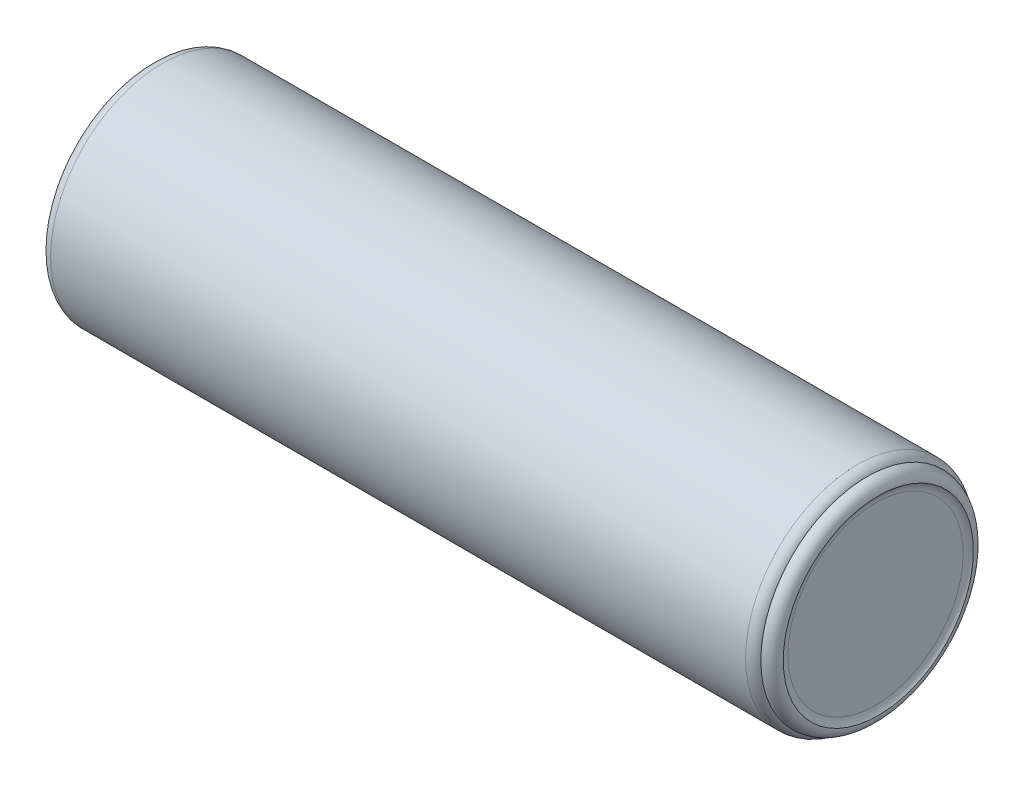
ISO-10303-21;
HEADER;
FILE_DESCRIPTION(('STEP AP214'),'2;1');
FILE_NAME('part.step','',(''),(''),'','','');
FILE_SCHEMA(('AUTOMOTIVE_DESIGN { 1 0 10303 214 1 1 1 1 }'));
ENDSEC;
DATA;
#1=APPLICATION_CONTEXT('core data for automotive mechanical design processes');
#2=APPLICATION_PROTOCOL_DEFINITION('international standard','automotive_design',2000,#1);
#3=PRODUCT_CONTEXT('',#1,'mechanical');
#4=PRODUCT('Part','Part','',(#3));
#5=PRODUCT_RELATED_PRODUCT_CATEGORY('part','',(#4));
#6=PRODUCT_DEFINITION_FORMATION('','',#4);
#7=PRODUCT_DEFINITION_CONTEXT('part definition',#1,'design');
#8=PRODUCT_DEFINITION('design','',#6,#7);
#9=PRODUCT_DEFINITION_SHAPE('','',#8);
#10=(LENGTH_UNIT() NAMED_UNIT(*) SI_UNIT(.MILLI.,.METRE.));
#11=(NAMED_UNIT(*) PLANE_ANGLE_UNIT() SI_UNIT($,.RADIAN.));
#12=(NAMED_UNIT(*) SI_UNIT($,.STERADIAN.) SOLID_ANGLE_UNIT());
#13=UNCERTAINTY_MEASURE_WITH_UNIT(LENGTH_MEASURE(1.E-05),#10,'distance_accuracy_value','');
#14=(GEOMETRIC_REPRESENTATION_CONTEXT(3) GLOBAL_UNCERTAINTY_ASSIGNED_CONTEXT((#13)) GLOBAL_UNIT_ASSIGNED_CONTEXT((#10,
#11,#12)) REPRESENTATION_CONTEXT('',''));
#15=CARTESIAN_POINT('',(0.,0.,0.));
#16=DIRECTION('',(0.,0.,1.));
#17=DIRECTION('',(1.,0.,0.));
#18=AXIS2_PLACEMENT_3D('',#15,#16,#17);
#19=CARTESIAN_POINT('',(3.275,0.85,0.));
#20=DIRECTION('',(-1.,0.,0.));
#21=DIRECTION('',(0.,0.,1.));
#22=AXIS2_PLACEMENT_3D('',#19,#20,#21);
#23=PLANE('',#22);
#24=CARTESIAN_POINT('',(3.275,0.,0.));
#25=DIRECTION('',(-1.,0.,0.));
#26=DIRECTION('',(0.,0.,-1.));
#27=AXIS2_PLACEMENT_3D('',#24,#25,#26);
#28=CIRCLE('',#27,0.783856217223);
#29=CARTESIAN_POINT('',(3.275,0.,0.783856217223));
#30=VERTEX_POINT('',#29);
#31=CARTESIAN_POINT('',(3.275,0.,-0.783856217223));
#32=VERTEX_POINT('',#31);
#33=EDGE_CURVE('E45',#30,#32,#28,.F.);
#34=ORIENTED_EDGE('',*,*,#33,.T.);
#35=CARTESIAN_POINT('',(3.275,0.,0.));
#36=DIRECTION('',(-1.,0.,0.));
#37=DIRECTION('',(0.,0.,1.));
#38=AXIS2_PLACEMENT_3D('',#35,#36,#37);
#39=CIRCLE('',#38,0.783856217223);
#40=EDGE_CURVE('E48',#32,#30,#39,.F.);
#41=ORIENTED_EDGE('',*,*,#40,.T.);
#42=EDGE_LOOP('',(#34,#41));
#43=FACE_BOUND('',#42,.T.);
#44=ADVANCED_FACE('F17',(#43),#23,.F.);
#45=CARTESIAN_POINT('',(3.375,0.,0.));
#46=DIRECTION('',(1.,0.,0.));
#47=DIRECTION('',(0.,0.,-1.));
#48=AXIS2_PLACEMENT_3D('',#45,#46,#47);
#49=TOROIDAL_SURFACE('',#48,0.783856217223,0.1);
#50=ORIENTED_EDGE('',*,*,#40,.F.);
#51=ORIENTED_EDGE('',*,*,#33,.F.);
#52=EDGE_LOOP('',(#50,#51));
#53=FACE_BOUND('',#52,.T.);
#54=CARTESIAN_POINT('',(3.3,0.,0.));
#55=DIRECTION('',(-1.,0.,0.));
#56=DIRECTION('',(0.,0.,1.));
#57=AXIS2_PLACEMENT_3D('',#54,#55,#56);
#58=CIRCLE('',#57,0.85);
#59=CARTESIAN_POINT('',(3.3,0.,0.85));
#60=VERTEX_POINT('',#59);
#61=EDGE_CURVE('E52',#60,#60,#58,.T.);
#62=ORIENTED_EDGE('',*,*,#61,.F.);
#63=EDGE_LOOP('',(#62));
#64=FACE_BOUND('',#63,.T.);
#65=ADVANCED_FACE('F55',(#53,#64),#49,.F.);
#66=CARTESIAN_POINT('',(3.2,0.,0.));
#67=DIRECTION('',(-1.,0.,0.));
#68=DIRECTION('',(0.,0.,1.));
#69=AXIS2_PLACEMENT_3D('',#66,#67,#68);
#70=TOROIDAL_SURFACE('',#69,0.85,0.1);
#71=CARTESIAN_POINT('',(3.20000000000033,0.,0.));
#72=DIRECTION('',(1.,0.,0.));
#73=DIRECTION('',(0.,0.,-1.));
#74=AXIS2_PLACEMENT_3D('',#71,#72,#73);
#75=CIRCLE('',#74,0.950000000000192);
#76=CARTESIAN_POINT('',(3.20000000000033,0.,-0.950000000000192));
#77=VERTEX_POINT('',#76);
#78=EDGE_CURVE('E85',#77,#77,#75,.F.);
#79=ORIENTED_EDGE('',*,*,#78,.F.);
#80=EDGE_LOOP('',(#79));
#81=FACE_BOUND('',#80,.T.);
#82=ORIENTED_EDGE('',*,*,#61,.T.);
#83=EDGE_LOOP('',(#82));
#84=FACE_BOUND('',#83,.T.);
#85=ADVANCED_FACE('F102',(#81,#84),#70,.T.);
#86=CARTESIAN_POINT('',(-3.2,0.,0.));
#87=DIRECTION('',(1.,0.,0.));
#88=DIRECTION('',(0.,0.,-1.));
#89=AXIS2_PLACEMENT_3D('',#86,#87,#88);
#90=PLANE('',#89);
#91=CARTESIAN_POINT('',(-3.2,0.,0.));
#92=DIRECTION('',(1.,0.,0.));
#93=DIRECTION('',(0.,0.,-1.));
#94=AXIS2_PLACEMENT_3D('',#91,#92,#93);
#95=CIRCLE('',#94,0.9);
#96=CARTESIAN_POINT('',(-3.2,0.,-0.9));
#97=VERTEX_POINT('',#96);
#98=CARTESIAN_POINT('',(-3.2,0.,0.9));
#99=VERTEX_POINT('',#98);
#100=EDGE_CURVE('E88',#97,#99,#95,.T.);
#101=ORIENTED_EDGE('',*,*,#100,.F.);
#102=CARTESIAN_POINT('',(-3.2,0.,0.));
#103=DIRECTION('',(1.,0.,0.));
#104=DIRECTION('',(0.,0.,1.));
#105=AXIS2_PLACEMENT_3D('',#102,#103,#104);
#106=CIRCLE('',#105,0.9);
#107=EDGE_CURVE('E36',#99,#97,#106,.T.);
#108=ORIENTED_EDGE('',*,*,#107,.F.);
#109=EDGE_LOOP('',(#101,#108));
#110=FACE_BOUND('',#109,.T.);
#111=ADVANCED_FACE('F93',(#110),#90,.F.);
#112=CARTESIAN_POINT('',(3.113397459622,0.,0.));
#113=DIRECTION('',(1.,0.,0.));
#114=DIRECTION('',(0.,0.,-1.));
#115=AXIS2_PLACEMENT_3D('',#112,#113,#114);
#116=TOROIDAL_SURFACE('',#115,0.9,0.1);
#117=ORIENTED_EDGE('',*,*,#78,.T.);
#118=EDGE_LOOP('',(#117));
#119=FACE_BOUND('',#118,.T.);
#120=CARTESIAN_POINT('',(3.113397459622,0.,0.));
#121=DIRECTION('',(-1.,0.,0.));
#122=DIRECTION('',(0.,0.,1.));
#123=AXIS2_PLACEMENT_3D('',#120,#121,#122);
#124=CIRCLE('',#123,1.);
#125=CARTESIAN_POINT('',(3.113397459622,0.,1.));
#126=VERTEX_POINT('',#125);
#127=EDGE_CURVE('E28',#126,#126,#124,.T.);
#128=ORIENTED_EDGE('',*,*,#127,.F.);
#129=EDGE_LOOP('',(#128));
#130=FACE_BOUND('',#129,.T.);
#131=ADVANCED_FACE('F75',(#119,#130),#116,.T.);
#132=CARTESIAN_POINT('',(-3.1,0.,0.));
#133=DIRECTION('',(1.,0.,0.));
#134=DIRECTION('',(0.,0.,-1.));
#135=AXIS2_PLACEMENT_3D('',#132,#133,#134);
#136=TOROIDAL_SURFACE('',#135,0.9,0.1);
#137=CARTESIAN_POINT('',(-3.1,0.,0.));
#138=DIRECTION('',(-1.,0.,0.));
#139=DIRECTION('',(0.,0.,1.));
#140=AXIS2_PLACEMENT_3D('',#137,#138,#139);
#141=CIRCLE('',#140,1.);
#142=CARTESIAN_POINT('',(-3.1,0.,1.));
#143=VERTEX_POINT('',#142);
#144=EDGE_CURVE('E11',#143,#143,#141,.F.);
#145=ORIENTED_EDGE('',*,*,#144,.F.);
#146=EDGE_LOOP('',(#145));
#147=FACE_BOUND('',#146,.T.);
#148=ORIENTED_EDGE('',*,*,#100,.T.);
#149=ORIENTED_EDGE('',*,*,#107,.T.);
#150=EDGE_LOOP('',(#148,#149));
#151=FACE_BOUND('',#150,.T.);
#152=ADVANCED_FACE('F63',(#147,#151),#136,.T.);
#153=CARTESIAN_POINT('',(-30.13072498029,0.,0.));
#154=DIRECTION('',(-1.,0.,0.));
#155=DIRECTION('',(0.,0.,1.));
#156=AXIS2_PLACEMENT_3D('',#153,#154,#155);
#157=CYLINDRICAL_SURFACE('',#156,1.);
#158=ORIENTED_EDGE('',*,*,#144,.T.);
#159=EDGE_LOOP('',(#158));
#160=FACE_BOUND('',#159,.T.);
#161=ORIENTED_EDGE('',*,*,#127,.T.);
#162=EDGE_LOOP('',(#161));
#163=FACE_BOUND('',#162,.T.);
#164=ADVANCED_FACE('F74',(#160,#163),#157,.T.);
#165=CLOSED_SHELL('',(#44,#65,#85,#111,#131,#152,#164));
#166=MANIFOLD_SOLID_BREP('B1',#165);
#167=ADVANCED_BREP_SHAPE_REPRESENTATION('',(#18,#166),#14);
#168=SHAPE_DEFINITION_REPRESENTATION(#9,#167);
ENDSEC;
END-ISO-10303-21;
